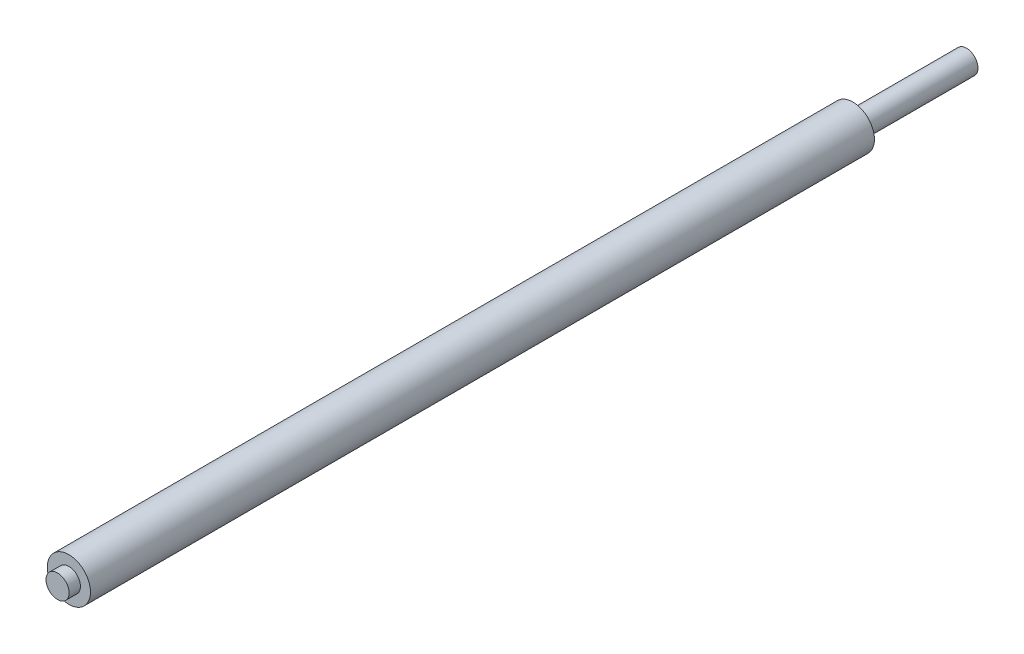
ISO-10303-21;
HEADER;
FILE_DESCRIPTION(('STEP AP214'),'2;1');
FILE_NAME('part.step','',(''),(''),'','','');
FILE_SCHEMA(('AUTOMOTIVE_DESIGN { 1 0 10303 214 1 1 1 1 }'));
ENDSEC;
DATA;
#1=APPLICATION_CONTEXT('core data for automotive mechanical design processes');
#2=APPLICATION_PROTOCOL_DEFINITION('international standard','automotive_design',2000,#1);
#3=PRODUCT_CONTEXT('',#1,'mechanical');
#4=PRODUCT('Part','Part','',(#3));
#5=PRODUCT_RELATED_PRODUCT_CATEGORY('part','',(#4));
#6=PRODUCT_DEFINITION_FORMATION('','',#4);
#7=PRODUCT_DEFINITION_CONTEXT('part definition',#1,'design');
#8=PRODUCT_DEFINITION('design','',#6,#7);
#9=PRODUCT_DEFINITION_SHAPE('','',#8);
#10=(LENGTH_UNIT() NAMED_UNIT(*) SI_UNIT(.MILLI.,.METRE.));
#11=(NAMED_UNIT(*) PLANE_ANGLE_UNIT() SI_UNIT($,.RADIAN.));
#12=(NAMED_UNIT(*) SI_UNIT($,.STERADIAN.) SOLID_ANGLE_UNIT());
#13=UNCERTAINTY_MEASURE_WITH_UNIT(LENGTH_MEASURE(1.E-05),#10,'distance_accuracy_value','');
#14=(GEOMETRIC_REPRESENTATION_CONTEXT(3) GLOBAL_UNCERTAINTY_ASSIGNED_CONTEXT((#13)) GLOBAL_UNIT_ASSIGNED_CONTEXT((#10,
#11,#12)) REPRESENTATION_CONTEXT('',''));
#15=CARTESIAN_POINT('',(0.,0.,0.));
#16=DIRECTION('',(0.,0.,1.));
#17=DIRECTION('',(1.,0.,0.));
#18=AXIS2_PLACEMENT_3D('',#15,#16,#17);
#19=CARTESIAN_POINT('',(0.,0.,4.));
#20=DIRECTION('',(0.,0.,-1.));
#21=DIRECTION('',(-1.,0.,0.));
#22=AXIS2_PLACEMENT_3D('',#19,#20,#21);
#23=CYLINDRICAL_SURFACE('',#22,0.1016);
#24=CARTESIAN_POINT('',(0.,0.,-4.));
#25=DIRECTION('',(0.,0.,1.));
#26=DIRECTION('',(1.,0.,0.));
#27=AXIS2_PLACEMENT_3D('',#24,#25,#26);
#28=CIRCLE('',#27,0.1016);
#29=CARTESIAN_POINT('',(0.1016,0.,-4.));
#30=VERTEX_POINT('',#29);
#31=EDGE_CURVE('E44',#30,#30,#28,.T.);
#32=ORIENTED_EDGE('',*,*,#31,.T.);
#33=EDGE_LOOP('',(#32));
#34=FACE_BOUND('',#33,.T.);
#35=CARTESIAN_POINT('',(0.,0.,-3.));
#36=DIRECTION('',(0.,0.,1.));
#37=DIRECTION('',(1.,0.,0.));
#38=AXIS2_PLACEMENT_3D('',#35,#36,#37);
#39=CIRCLE('',#38,0.1016);
#40=CARTESIAN_POINT('',(0.1016,0.,-3.));
#41=VERTEX_POINT('',#40);
#42=EDGE_CURVE('E10',#41,#41,#39,.T.);
#43=ORIENTED_EDGE('',*,*,#42,.F.);
#44=EDGE_LOOP('',(#43));
#45=FACE_BOUND('',#44,.T.);
#46=ADVANCED_FACE('F33',(#34,#45),#23,.T.);
#47=CARTESIAN_POINT('',(0.,0.,-4.));
#48=DIRECTION('',(0.,0.,1.));
#49=DIRECTION('',(1.,0.,0.));
#50=AXIS2_PLACEMENT_3D('',#47,#48,#49);
#51=PLANE('',#50);
#52=ORIENTED_EDGE('',*,*,#31,.F.);
#53=EDGE_LOOP('',(#52));
#54=FACE_BOUND('',#53,.T.);
#55=ADVANCED_FACE('F69',(#54),#51,.F.);
#56=CARTESIAN_POINT('',(0.,0.00112995751647438,-3.));
#57=DIRECTION('',(0.,0.,1.));
#58=DIRECTION('',(1.,0.,0.));
#59=AXIS2_PLACEMENT_3D('',#56,#57,#58);
#60=CYLINDRICAL_SURFACE('',#59,0.19);
#61=CARTESIAN_POINT('',(0.,0.00112995751647438,-3.));
#62=DIRECTION('',(0.,0.,1.));
#63=DIRECTION('',(1.,0.,0.));
#64=AXIS2_PLACEMENT_3D('',#61,#62,#63);
#65=CIRCLE('',#64,0.19);
#66=CARTESIAN_POINT('',(0.19,0.00112995751647438,-3.));
#67=VERTEX_POINT('',#66);
#68=EDGE_CURVE('E52',#67,#67,#65,.T.);
#69=ORIENTED_EDGE('',*,*,#68,.T.);
#70=EDGE_LOOP('',(#69));
#71=FACE_BOUND('',#70,.T.);
#72=CARTESIAN_POINT('',(0.,0.00112995751647438,3.9));
#73=DIRECTION('',(0.,0.,1.));
#74=DIRECTION('',(1.,0.,0.));
#75=AXIS2_PLACEMENT_3D('',#72,#73,#74);
#76=CIRCLE('',#75,0.19);
#77=CARTESIAN_POINT('',(0.19,0.00112995751647438,3.9));
#78=VERTEX_POINT('',#77);
#79=EDGE_CURVE('E58',#78,#78,#76,.T.);
#80=ORIENTED_EDGE('',*,*,#79,.F.);
#81=EDGE_LOOP('',(#80));
#82=FACE_BOUND('',#81,.T.);
#83=ADVANCED_FACE('F66',(#71,#82),#60,.T.);
#84=CARTESIAN_POINT('',(0.,0.00112995751647438,-3.));
#85=DIRECTION('',(0.,0.,1.));
#86=DIRECTION('',(1.,0.,0.));
#87=AXIS2_PLACEMENT_3D('',#84,#85,#86);
#88=PLANE('',#87);
#89=ORIENTED_EDGE('',*,*,#42,.T.);
#90=EDGE_LOOP('',(#89));
#91=FACE_BOUND('',#90,.T.);
#92=ORIENTED_EDGE('',*,*,#68,.F.);
#93=EDGE_LOOP('',(#92));
#94=FACE_BOUND('',#93,.T.);
#95=ADVANCED_FACE('F68',(#91,#94),#88,.F.);
#96=CARTESIAN_POINT('',(0.,0.00112995751647438,3.9));
#97=DIRECTION('',(0.,0.,1.));
#98=DIRECTION('',(1.,0.,0.));
#99=AXIS2_PLACEMENT_3D('',#96,#97,#98);
#100=PLANE('',#99);
#101=CARTESIAN_POINT('',(0.,0.,3.9));
#102=DIRECTION('',(0.,0.,1.));
#103=DIRECTION('',(1.,0.,0.));
#104=AXIS2_PLACEMENT_3D('',#101,#102,#103);
#105=CIRCLE('',#104,0.1016);
#106=CARTESIAN_POINT('',(0.1016,0.,3.9));
#107=VERTEX_POINT('',#106);
#108=EDGE_CURVE('E49',#107,#107,#105,.T.);
#109=ORIENTED_EDGE('',*,*,#108,.F.);
#110=EDGE_LOOP('',(#109));
#111=FACE_BOUND('',#110,.T.);
#112=ORIENTED_EDGE('',*,*,#79,.T.);
#113=EDGE_LOOP('',(#112));
#114=FACE_BOUND('',#113,.T.);
#115=ADVANCED_FACE('F64',(#111,#114),#100,.T.);
#116=CARTESIAN_POINT('',(0.,0.,4.));
#117=DIRECTION('',(0.,0.,1.));
#118=DIRECTION('',(1.,0.,0.));
#119=AXIS2_PLACEMENT_3D('',#116,#117,#118);
#120=PLANE('',#119);
#121=CARTESIAN_POINT('',(0.,0.,4.));
#122=DIRECTION('',(0.,0.,1.));
#123=DIRECTION('',(1.,0.,0.));
#124=AXIS2_PLACEMENT_3D('',#121,#122,#123);
#125=CIRCLE('',#124,0.1016);
#126=CARTESIAN_POINT('',(0.1016,0.,4.));
#127=VERTEX_POINT('',#126);
#128=EDGE_CURVE('E40',#127,#127,#125,.T.);
#129=ORIENTED_EDGE('',*,*,#128,.T.);
#130=EDGE_LOOP('',(#129));
#131=FACE_BOUND('',#130,.T.);
#132=ADVANCED_FACE('F84',(#131),#120,.T.);
#133=ORIENTED_EDGE('',*,*,#108,.T.);
#134=EDGE_LOOP('',(#133));
#135=FACE_BOUND('',#134,.T.);
#136=ORIENTED_EDGE('',*,*,#128,.F.);
#137=EDGE_LOOP('',(#136));
#138=FACE_BOUND('',#137,.T.);
#139=ADVANCED_FACE('F35',(#135,#138),#23,.T.);
#140=CLOSED_SHELL('',(#46,#55,#83,#95,#115,#132,#139));
#141=MANIFOLD_SOLID_BREP('B2',#140);
#142=ADVANCED_BREP_SHAPE_REPRESENTATION('',(#18,#141),#14);
#143=SHAPE_DEFINITION_REPRESENTATION(#9,#142);
ENDSEC;
END-ISO-10303-21;
